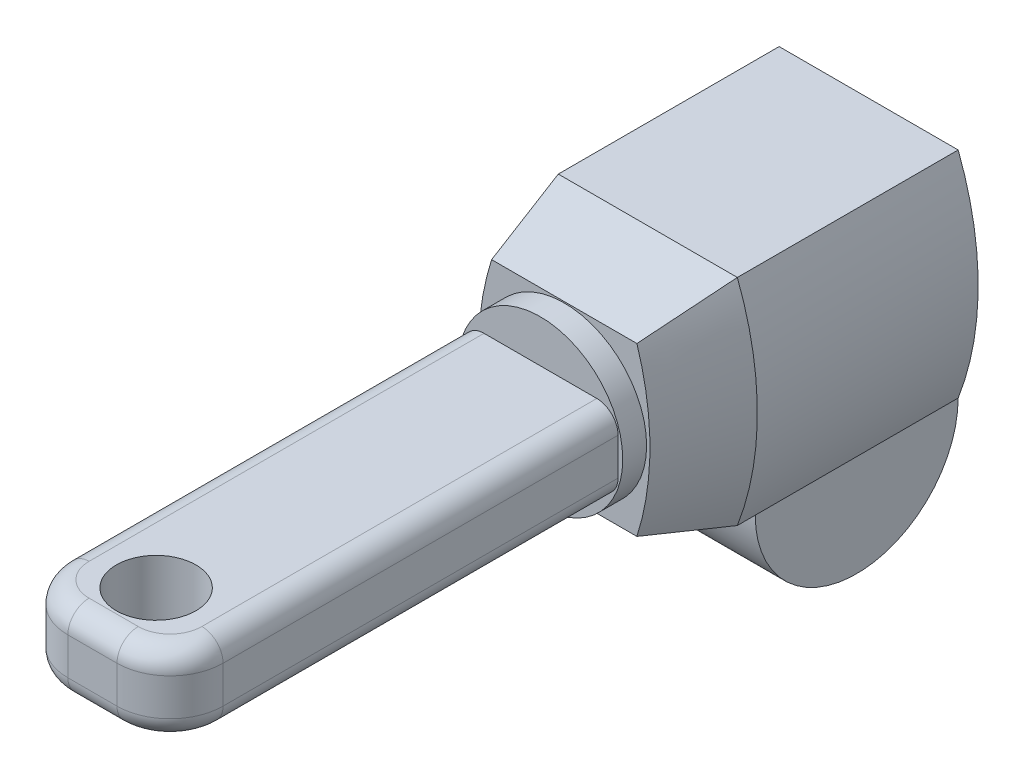
ISO-10303-21;
HEADER;
FILE_DESCRIPTION(('STEP AP214'),'2;1');
FILE_NAME('part.step','',(''),(''),'','','');
FILE_SCHEMA(('AUTOMOTIVE_DESIGN { 1 0 10303 214 1 1 1 1 }'));
ENDSEC;
DATA;
#1=APPLICATION_CONTEXT('core data for automotive mechanical design processes');
#2=APPLICATION_PROTOCOL_DEFINITION('international standard','automotive_design',2000,#1);
#3=PRODUCT_CONTEXT('',#1,'mechanical');
#4=PRODUCT('Part','Part','',(#3));
#5=PRODUCT_RELATED_PRODUCT_CATEGORY('part','',(#4));
#6=PRODUCT_DEFINITION_FORMATION('','',#4);
#7=PRODUCT_DEFINITION_CONTEXT('part definition',#1,'design');
#8=PRODUCT_DEFINITION('design','',#6,#7);
#9=PRODUCT_DEFINITION_SHAPE('','',#8);
#10=(LENGTH_UNIT() NAMED_UNIT(*) SI_UNIT(.MILLI.,.METRE.));
#11=(NAMED_UNIT(*) PLANE_ANGLE_UNIT() SI_UNIT($,.RADIAN.));
#12=(NAMED_UNIT(*) SI_UNIT($,.STERADIAN.) SOLID_ANGLE_UNIT());
#13=UNCERTAINTY_MEASURE_WITH_UNIT(LENGTH_MEASURE(1.E-05),#10,'distance_accuracy_value','');
#14=(GEOMETRIC_REPRESENTATION_CONTEXT(3) GLOBAL_UNCERTAINTY_ASSIGNED_CONTEXT((#13)) GLOBAL_UNIT_ASSIGNED_CONTEXT((#10,
#11,#12)) REPRESENTATION_CONTEXT('',''));
#15=CARTESIAN_POINT('',(0.,0.,0.));
#16=DIRECTION('',(0.,0.,1.));
#17=DIRECTION('',(1.,0.,0.));
#18=AXIS2_PLACEMENT_3D('',#15,#16,#17);
#19=CARTESIAN_POINT('',(-36.1419187009576,-5.641327459746,110.472156997198));
#20=DIRECTION('',(0.,0.,1.));
#21=DIRECTION('',(1.,0.,0.));
#22=AXIS2_PLACEMENT_3D('',#19,#20,#21);
#23=PLANE('',#22);
#24=CARTESIAN_POINT('',(-36.1419187009576,-5.641327459746,110.472156997198));
#25=DIRECTION('',(0.,0.,1.));
#26=DIRECTION('',(1.,0.,0.));
#27=AXIS2_PLACEMENT_3D('',#24,#25,#26);
#28=CIRCLE('',#27,51.75);
#29=CARTESIAN_POINT('',(13.1531114745073,-21.391327459746,110.472156997198));
#30=VERTEX_POINT('',#29);
#31=CARTESIAN_POINT('',(13.1531114745073,10.108672540254,110.472156997198));
#32=VERTEX_POINT('',#31);
#33=EDGE_CURVE('E435',#30,#32,#28,.T.);
#34=ORIENTED_EDGE('',*,*,#33,.T.);
#35=DIRECTION('',(-1.,0.,0.));
#36=VECTOR('',#35,1.);
#37=CARTESIAN_POINT('',(13.1531114745073,10.108672540254,110.472156997198));
#38=LINE('',#37,#36);
#39=CARTESIAN_POINT('',(-14.2298147692071,10.108672540254,110.472156997198));
#40=VERTEX_POINT('',#39);
#41=EDGE_CURVE('E369',#32,#40,#38,.T.);
#42=ORIENTED_EDGE('',*,*,#41,.T.);
#43=CARTESIAN_POINT('',(35.0652154062578,-5.64132745974601,110.472156997198));
#44=DIRECTION('',(0.,0.,1.));
#45=DIRECTION('',(1.,0.,0.));
#46=AXIS2_PLACEMENT_3D('',#43,#44,#45);
#47=CIRCLE('',#46,51.75);
#48=CARTESIAN_POINT('',(-14.2298147692071,-21.391327459746,110.472156997198));
#49=VERTEX_POINT('',#48);
#50=EDGE_CURVE('E383',#40,#49,#47,.T.);
#51=ORIENTED_EDGE('',*,*,#50,.T.);
#52=DIRECTION('',(1.,0.,0.));
#53=VECTOR('',#52,1.);
#54=CARTESIAN_POINT('',(-14.2298147692071,-21.391327459746,110.472156997198));
#55=LINE('',#54,#53);
#56=EDGE_CURVE('E459',#49,#30,#55,.T.);
#57=ORIENTED_EDGE('',*,*,#56,.T.);
#58=EDGE_LOOP('',(#34,#42,#51,#57));
#59=FACE_BOUND('',#58,.T.);
#60=CARTESIAN_POINT('',(-0.538351647349898,-5.64132745974601,110.472156997198));
#61=DIRECTION('',(0.,0.,1.));
#62=DIRECTION('',(1.,0.,0.));
#63=AXIS2_PLACEMENT_3D('',#60,#61,#62);
#64=CIRCLE('',#63,15.525);
#65=CARTESIAN_POINT('',(14.9866483526501,-5.64132745974601,110.472156997198));
#66=VERTEX_POINT('',#65);
#67=EDGE_CURVE('E454',#66,#66,#64,.T.);
#68=ORIENTED_EDGE('',*,*,#67,.F.);
#69=EDGE_LOOP('',(#68));
#70=FACE_BOUND('',#69,.T.);
#71=ADVANCED_FACE('F65',(#59,#70),#23,.T.);
#72=CARTESIAN_POINT('',(-0.538351647349898,-5.64132745974601,114.972156997198));
#73=DIRECTION('',(0.,0.,-1.));
#74=DIRECTION('',(-1.,0.,0.));
#75=AXIS2_PLACEMENT_3D('',#72,#73,#74);
#76=CYLINDRICAL_SURFACE('',#75,15.525);
#77=ORIENTED_EDGE('',*,*,#67,.T.);
#78=EDGE_LOOP('',(#77));
#79=FACE_BOUND('',#78,.T.);
#80=CARTESIAN_POINT('',(-0.538351647349898,-5.64132745974601,114.972156997198));
#81=DIRECTION('',(0.,0.,1.));
#82=DIRECTION('',(1.,0.,0.));
#83=AXIS2_PLACEMENT_3D('',#80,#81,#82);
#84=CIRCLE('',#83,15.525);
#85=CARTESIAN_POINT('',(14.9866483526501,-5.64132745974601,114.972156997198));
#86=VERTEX_POINT('',#85);
#87=EDGE_CURVE('E300',#86,#86,#84,.T.);
#88=ORIENTED_EDGE('',*,*,#87,.F.);
#89=EDGE_LOOP('',(#88));
#90=FACE_BOUND('',#89,.T.);
#91=ADVANCED_FACE('F331',(#79,#90),#76,.T.);
#92=CARTESIAN_POINT('',(-0.538351647349898,-5.64132745974601,114.972156997198));
#93=DIRECTION('',(0.,0.,1.));
#94=DIRECTION('',(1.,0.,0.));
#95=AXIS2_PLACEMENT_3D('',#92,#93,#94);
#96=PLANE('',#95);
#97=ORIENTED_EDGE('',*,*,#87,.T.);
#98=EDGE_LOOP('',(#97));
#99=FACE_BOUND('',#98,.T.);
#100=DIRECTION('',(-1.,0.,0.));
#101=VECTOR('',#100,1.);
#102=CARTESIAN_POINT('',(-0.538351647349898,1.85867254025399,114.972156997198));
#103=LINE('',#102,#101);
#104=CARTESIAN_POINT('',(10.1026961262499,1.85867254025399,114.972156997198));
#105=VERTEX_POINT('',#104);
#106=CARTESIAN_POINT('',(-11.1633516473499,1.85867254025399,114.972156997198));
#107=VERTEX_POINT('',#106);
#108=EDGE_CURVE('E178',#105,#107,#103,.T.);
#109=ORIENTED_EDGE('',*,*,#108,.F.);
#110=CARTESIAN_POINT('',(10.1026961262499,-2.14132745974601,114.972156997198));
#111=DIRECTION('',(0.,0.,1.));
#112=DIRECTION('',(1.,0.,0.));
#113=AXIS2_PLACEMENT_3D('',#110,#111,#112);
#114=CIRCLE('',#113,4.);
#115=CARTESIAN_POINT('',(14.1026961262499,-2.14132745974601,114.972156997198));
#116=VERTEX_POINT('',#115);
#117=EDGE_CURVE('E12',#105,#116,#114,.F.);
#118=ORIENTED_EDGE('',*,*,#117,.T.);
#119=DIRECTION('',(0.,-1.,0.));
#120=VECTOR('',#119,1.);
#121=CARTESIAN_POINT('',(14.1026961262499,-5.64132745974601,114.972156997198));
#122=LINE('',#121,#120);
#123=CARTESIAN_POINT('',(14.1026961262499,-9.14132745974601,114.972156997198));
#124=VERTEX_POINT('',#123);
#125=EDGE_CURVE('E508',#116,#124,#122,.T.);
#126=ORIENTED_EDGE('',*,*,#125,.T.);
#127=CARTESIAN_POINT('',(10.1026961262499,-9.14132745974601,114.972156997198));
#128=DIRECTION('',(0.,0.,1.));
#129=DIRECTION('',(1.,0.,0.));
#130=AXIS2_PLACEMENT_3D('',#127,#128,#129);
#131=CIRCLE('',#130,4.);
#132=CARTESIAN_POINT('',(10.1026961262499,-13.141327459746,114.972156997198));
#133=VERTEX_POINT('',#132);
#134=EDGE_CURVE('E108',#124,#133,#131,.F.);
#135=ORIENTED_EDGE('',*,*,#134,.T.);
#136=DIRECTION('',(-1.,0.,0.));
#137=VECTOR('',#136,1.);
#138=CARTESIAN_POINT('',(-0.538351647349898,-13.141327459746,114.972156997198));
#139=LINE('',#138,#137);
#140=CARTESIAN_POINT('',(-11.1633516473499,-13.141327459746,114.972156997198));
#141=VERTEX_POINT('',#140);
#142=EDGE_CURVE('E506',#133,#141,#139,.T.);
#143=ORIENTED_EDGE('',*,*,#142,.T.);
#144=CARTESIAN_POINT('',(-11.1633516473499,-9.14132745974601,114.972156997198));
#145=DIRECTION('',(0.,0.,1.));
#146=DIRECTION('',(1.,0.,0.));
#147=AXIS2_PLACEMENT_3D('',#144,#145,#146);
#148=CIRCLE('',#147,4.);
#149=CARTESIAN_POINT('',(-15.1633516473499,-9.14132745974601,114.972156997198));
#150=VERTEX_POINT('',#149);
#151=EDGE_CURVE('E75',#141,#150,#148,.F.);
#152=ORIENTED_EDGE('',*,*,#151,.T.);
#153=DIRECTION('',(0.,1.,0.));
#154=VECTOR('',#153,1.);
#155=CARTESIAN_POINT('',(-15.1633516473499,-5.64132745974601,114.972156997198));
#156=LINE('',#155,#154);
#157=CARTESIAN_POINT('',(-15.1633516473499,-2.14132745974601,114.972156997198));
#158=VERTEX_POINT('',#157);
#159=EDGE_CURVE('E200',#150,#158,#156,.T.);
#160=ORIENTED_EDGE('',*,*,#159,.T.);
#161=CARTESIAN_POINT('',(-11.1633516473499,-2.14132745974601,114.972156997198));
#162=DIRECTION('',(0.,0.,1.));
#163=DIRECTION('',(1.,0.,0.));
#164=AXIS2_PLACEMENT_3D('',#161,#162,#163);
#165=CIRCLE('',#164,4.);
#166=EDGE_CURVE('E186',#158,#107,#165,.F.);
#167=ORIENTED_EDGE('',*,*,#166,.T.);
#168=EDGE_LOOP('',(#109,#118,#126,#135,#143,#152,#160,#167));
#169=FACE_BOUND('',#168,.T.);
#170=ADVANCED_FACE('F328',(#99,#169),#96,.T.);
#171=CARTESIAN_POINT('',(35.0652154062578,-5.64132745974601,94.7221569971984));
#172=DIRECTION('',(0.,0.,-1.));
#173=DIRECTION('',(-1.,0.,0.));
#174=AXIS2_PLACEMENT_3D('',#171,#172,#173);
#175=CYLINDRICAL_SURFACE('',#174,56.25);
#176=CARTESIAN_POINT('',(35.0652154062578,-5.64132745974601,53.0971569971984));
#177=DIRECTION('',(0.,0.,-1.));
#178=DIRECTION('',(-1.,0.,0.));
#179=AXIS2_PLACEMENT_3D('',#176,#177,#178);
#180=CIRCLE('',#179,56.25);
#181=CARTESIAN_POINT('',(-17.4133516473499,-25.891327459746,53.0971569971984));
#182=VERTEX_POINT('',#181);
#183=CARTESIAN_POINT('',(-17.4133516473499,14.608672540254,53.0971569971984));
#184=VERTEX_POINT('',#183);
#185=EDGE_CURVE('E277',#182,#184,#180,.T.);
#186=ORIENTED_EDGE('',*,*,#185,.F.);
#187=CARTESIAN_POINT('',(-17.4133516473499,-25.891327459746,91.3471569971984));
#188=CARTESIAN_POINT('',(-17.5104185757161,-25.6397807753165,91.3471566376483));
#189=CARTESIAN_POINT('',(-17.6056633746791,-25.3875583189539,91.3421932669848));
#190=CARTESIAN_POINT('',(-17.7923983084979,-24.8821107409464,91.3221857952732));
#191=CARTESIAN_POINT('',(-17.8838882390162,-24.6288855655544,91.3071411463784));
#192=CARTESIAN_POINT('',(-18.1525643347171,-23.8682145123364,91.2466495400304));
#193=CARTESIAN_POINT('',(-18.323935320634,-23.3598288088188,91.1858448545382));
#194=CARTESIAN_POINT('',(-18.6503120880124,-22.3443005606894,91.0223940848979));
#195=CARTESIAN_POINT('',(-18.8053101320169,-21.8371587134932,90.9197283286111));
#196=CARTESIAN_POINT('',(-19.0983551143492,-20.8283591851154,90.6721335333653));
#197=CARTESIAN_POINT('',(-19.2364043024954,-20.3267007841233,90.527210112395));
#198=CARTESIAN_POINT('',(-19.4957512707842,-19.3317763649012,90.1947390738719));
#199=CARTESIAN_POINT('',(-19.6170061642389,-18.8385345538694,90.0070854524369));
#200=CARTESIAN_POINT('',(-19.8426022423871,-17.8660263514256,89.5899465150905));
#201=CARTESIAN_POINT('',(-19.9469425521553,-17.3867606839958,89.360459036581));
#202=CARTESIAN_POINT('',(-20.1392314256772,-16.4469480601791,88.8610341093282));
#203=CARTESIAN_POINT('',(-20.2271951536682,-15.9863840987284,88.5911345031749));
#204=CARTESIAN_POINT('',(-20.3878137323153,-15.0876221134801,88.012382975135));
#205=CARTESIAN_POINT('',(-20.460469156566,-14.6494232521394,87.7035325134113));
#206=CARTESIAN_POINT('',(-20.5894799721445,-13.8138407738726,87.0602281339933));
#207=CARTESIAN_POINT('',(-20.6463092745931,-13.4155724473205,86.7270170084952));
#208=CARTESIAN_POINT('',(-20.7482067567926,-12.6466708110797,86.0284771800277));
#209=CARTESIAN_POINT('',(-20.7932751672224,-12.2760369594687,85.6631491071899));
#210=CARTESIAN_POINT('',(-20.8731346536954,-11.5651379562057,84.9027305994956));
#211=CARTESIAN_POINT('',(-20.907921385823,-11.2248856827424,84.5076276732519));
#212=CARTESIAN_POINT('',(-20.968725538915,-10.5774905622935,83.6905363375567));
#213=CARTESIAN_POINT('',(-20.9947428432628,-10.2703481556427,83.2685475706639));
#214=CARTESIAN_POINT('',(-21.0396925676538,-9.68944854732893,82.3976468224195));
#215=CARTESIAN_POINT('',(-21.0585753686107,-9.41593377350929,81.9485705963275));
#216=CARTESIAN_POINT('',(-21.0905033494419,-8.90673105934653,81.0292687886211));
#217=CARTESIAN_POINT('',(-21.1035485217847,-8.67104316780679,80.5590431797213));
#218=CARTESIAN_POINT('',(-21.125179230751,-8.23917663797602,79.6007335581555));
#219=CARTESIAN_POINT('',(-21.1337651121824,-8.04299494564709,79.1126509293812));
#220=CARTESIAN_POINT('',(-21.1476864014735,-7.69148116201624,78.1219447018919));
#221=CARTESIAN_POINT('',(-21.1530217732321,-7.53614952441832,77.6193209417437));
#222=CARTESIAN_POINT('',(-21.161510326557,-7.26507359542771,76.5941427071447));
#223=CARTESIAN_POINT('',(-21.164624028168,-7.15006314768279,76.071393722322));
#224=CARTESIAN_POINT('',(-21.1693027692721,-6.96424630354087,75.0180876652528));
#225=CARTESIAN_POINT('',(-21.1708677910705,-6.89344041221005,74.4875305038635));
#226=CARTESIAN_POINT('',(-21.1729421553996,-6.79652954503723,73.4223068807877));
#227=CARTESIAN_POINT('',(-21.1734514196453,-6.77042788405541,72.8876401173227));
#228=CARTESIAN_POINT('',(-21.1735976560809,-6.76311974625605,71.8180004558146));
#229=CARTESIAN_POINT('',(-21.1732346279763,-6.78191328459034,71.2830275576682));
#230=CARTESIAN_POINT('',(-21.1714998466945,-6.86446616203042,70.2139147360239));
#231=CARTESIAN_POINT('',(-21.1701231419361,-6.92844616395525,69.6797918450116));
#232=CARTESIAN_POINT('',(-21.1659045236098,-7.10115568053041,68.618833944166));
#233=CARTESIAN_POINT('',(-21.163062602605,-7.20988542231002,68.0919989713368));
#234=CARTESIAN_POINT('',(-21.1551608933048,-7.47131980924598,67.0493622093791));
#235=CARTESIAN_POINT('',(-21.1501010702615,-7.62402514335496,66.5335605932429));
#236=CARTESIAN_POINT('',(-21.1367360995137,-7.97231258826303,65.5166843203967));
#237=CARTESIAN_POINT('',(-21.1284309575771,-8.1678946228574,65.0156096375144));
#238=CARTESIAN_POINT('',(-21.107316610472,-8.60037386382517,64.0321059383534));
#239=CARTESIAN_POINT('',(-21.0945103589628,-8.83724392545267,63.5496649243968));
#240=CARTESIAN_POINT('',(-21.0629378660241,-9.35064243581475,62.6065648204316));
#241=CARTESIAN_POINT('',(-21.0441716170068,-9.62717093503986,62.1459057581554));
#242=CARTESIAN_POINT('',(-20.9990878944046,-10.2177967043679,61.2497353279577));
#243=CARTESIAN_POINT('',(-20.9727705955186,-10.5318931052125,60.8142233785197));
#244=CARTESIAN_POINT('',(-20.9109189497531,-11.1952263998526,59.9715342154452));
#245=CARTESIAN_POINT('',(-20.8753847128224,-11.5444628744324,59.5643566638816));
#246=CARTESIAN_POINT('',(-20.7938382290203,-12.2716446707778,58.7852307286668));
#247=CARTESIAN_POINT('',(-20.7479338804899,-12.6492693683617,58.4129718253275));
#248=CARTESIAN_POINT('',(-20.6439030655714,-13.4331758871302,57.701821819679));
#249=CARTESIAN_POINT('',(-20.5857766435096,-13.8394576043792,57.3629305963599));
#250=CARTESIAN_POINT('',(-20.4559078460925,-14.6771979905842,56.7209523166741));
#251=CARTESIAN_POINT('',(-20.3841685720213,-15.1086509095545,56.4178571307103));
#252=CARTESIAN_POINT('',(-20.2258729946382,-15.9931305610181,55.8493846943496));
#253=CARTESIAN_POINT('',(-20.1393171700024,-16.4461565962103,55.5840062259506));
#254=CARTESIAN_POINT('',(-19.9522198474631,-17.3613265037998,55.0970764161716));
#255=CARTESIAN_POINT('',(-19.8519668639369,-17.8231464136026,54.8748047907129));
#256=CARTESIAN_POINT('',(-19.6357344034792,-18.7600049299962,54.4691161710078));
#257=CARTESIAN_POINT('',(-19.5197540565106,-19.2350442667289,54.2857013277564));
#258=CARTESIAN_POINT('',(-19.2718449401945,-20.1943941679933,53.9583289317497));
#259=CARTESIAN_POINT('',(-19.139918001733,-20.6787036628209,53.8143668554686));
#260=CARTESIAN_POINT('',(-18.86025347897,-21.6526685839844,53.566005688811));
#261=CARTESIAN_POINT('',(-18.7125201108855,-22.1423225535934,53.4615960817568));
#262=CARTESIAN_POINT('',(-18.3845023709013,-23.1774649096015,53.2826276949992));
#263=CARTESIAN_POINT('',(-18.2024249792892,-23.7231811482907,53.2126047703829));
#264=CARTESIAN_POINT('',(-17.9160885211457,-24.5391306520538,53.1430697439539));
#265=CARTESIAN_POINT('',(-17.8185624114881,-24.8103580259568,53.12580748524));
#266=CARTESIAN_POINT('',(-17.6191725658775,-25.3517564032426,53.1028507054192));
#267=CARTESIAN_POINT('',(-17.5173081394036,-25.6219272309288,53.0971580328977));
#268=CARTESIAN_POINT('',(-17.4133516473499,-25.891327459746,53.0971569971984));
#269=B_SPLINE_CURVE_WITH_KNOTS('',3,(#187,#188,#189,#190,#191,#192,#193,#194,#195,#196,#197,
#198,#199,#200,#201,#202,#203,#204,#205,#206,#207,#208,#209,#210,#211,#212,#213,#214,#215,#216,
#217,#218,#219,#220,#221,#222,#223,#224,#225,#226,#227,#228,#229,#230,#231,#232,#233,#234,#235,
#236,#237,#238,#239,#240,#241,#242,#243,#244,#245,#246,#247,#248,#249,#250,#251,#252,#253,#254,
#255,#256,#257,#258,#259,#260,#261,#262,#263,#264,#265,#266,#267,#268),.UNSPECIFIED.,.F.,.F.,(4,
2,2,2,2,2,2,2,2,2,2,2,2,2,2,2,2,2,2,2,2,2,2,2,2,2,2,2,2,2,2,2,2,2,2,2,2,2,2,2,4),(0.,
0.808768404537017,1.61758076352306,3.23538405668106,4.85394849612409,6.47229785188958,
8.09470656763977,9.71719917748636,11.3381818517428,12.9591037777625,14.524385334762,
16.0896361879327,17.6555474031703,19.2214794412018,20.7981100883764,22.3747427696683,
23.951253522097,25.527781783414,27.1316713931021,28.7355793279501,30.3396061889123,
31.9436335912233,33.5555487250506,35.1674720403251,36.7794206105012,38.3913663157859,
40.0022562199447,41.6131481750011,43.2240028639247,44.8348383378767,46.4296281179534,
48.0244121142139,49.6188332215574,51.213202827871,52.7780621553322,54.3430080860956,
55.9077745101192,57.4721245830505,59.2082245208451,60.0742343114978,60.9403824620825),.UNSPECIFIED.);
#270=CARTESIAN_POINT('',(-17.4133516473499,-25.891327459746,91.3471569971984));
#271=VERTEX_POINT('',#270);
#272=EDGE_CURVE('E292',#271,#182,#269,.T.);
#273=ORIENTED_EDGE('',*,*,#272,.F.);
#274=DIRECTION('',(0.,0.,-1.));
#275=VECTOR('',#274,1.);
#276=CARTESIAN_POINT('',(-17.4133516473499,-25.891327459746,94.7221569971984));
#277=LINE('',#276,#275);
#278=CARTESIAN_POINT('',(-17.4133516473499,-25.891327459746,94.7221569971984));
#279=VERTEX_POINT('',#278);
#280=EDGE_CURVE('E447',#279,#271,#277,.T.);
#281=ORIENTED_EDGE('',*,*,#280,.F.);
#282=CARTESIAN_POINT('',(35.0652154062578,-5.64132745974601,94.7221569971984));
#283=DIRECTION('',(0.,0.,-1.));
#284=DIRECTION('',(-1.,0.,0.));
#285=AXIS2_PLACEMENT_3D('',#282,#283,#284);
#286=CIRCLE('',#285,56.25);
#287=CARTESIAN_POINT('',(-17.4133516473499,14.608672540254,94.7221569971984));
#288=VERTEX_POINT('',#287);
#289=EDGE_CURVE('E462',#288,#279,#286,.F.);
#290=ORIENTED_EDGE('',*,*,#289,.F.);
#291=DIRECTION('',(0.,0.,-1.));
#292=VECTOR('',#291,1.);
#293=CARTESIAN_POINT('',(-17.4133516473499,14.608672540254,94.7221569971984));
#294=LINE('',#293,#292);
#295=EDGE_CURVE('E295',#288,#184,#294,.T.);
#296=ORIENTED_EDGE('',*,*,#295,.T.);
#297=EDGE_LOOP('',(#186,#273,#281,#290,#296));
#298=FACE_BOUND('',#297,.T.);
#299=ADVANCED_FACE('F291',(#298),#175,.T.);
#300=CARTESIAN_POINT('',(-36.1419187009576,-5.641327459746,94.7221569971984));
#301=DIRECTION('',(0.,0.,-1.));
#302=DIRECTION('',(-1.,0.,0.));
#303=AXIS2_PLACEMENT_3D('',#300,#301,#302);
#304=CYLINDRICAL_SURFACE('',#303,56.25);
#305=CARTESIAN_POINT('',(-36.1419187009576,-5.641327459746,53.0971569971984));
#306=DIRECTION('',(0.,0.,-1.));
#307=DIRECTION('',(-1.,0.,0.));
#308=AXIS2_PLACEMENT_3D('',#305,#306,#307);
#309=CIRCLE('',#308,56.25);
#310=CARTESIAN_POINT('',(16.3366483526501,14.608672540254,53.0971569971984));
#311=VERTEX_POINT('',#310);
#312=CARTESIAN_POINT('',(16.3366483526501,-25.891327459746,53.0971569971984));
#313=VERTEX_POINT('',#312);
#314=EDGE_CURVE('E280',#311,#313,#309,.T.);
#315=ORIENTED_EDGE('',*,*,#314,.F.);
#316=DIRECTION('',(0.,0.,-1.));
#317=VECTOR('',#316,1.);
#318=CARTESIAN_POINT('',(16.3366483526501,14.608672540254,94.7221569971984));
#319=LINE('',#318,#317);
#320=CARTESIAN_POINT('',(16.3366483526501,14.608672540254,94.7221569971985));
#321=VERTEX_POINT('',#320);
#322=EDGE_CURVE('E451',#321,#311,#319,.T.);
#323=ORIENTED_EDGE('',*,*,#322,.F.);
#324=CARTESIAN_POINT('',(-36.1419187009576,-5.641327459746,94.7221569971984));
#325=DIRECTION('',(0.,0.,-1.));
#326=DIRECTION('',(-1.,0.,0.));
#327=AXIS2_PLACEMENT_3D('',#324,#325,#326);
#328=CIRCLE('',#327,56.25);
#329=CARTESIAN_POINT('',(16.3366483526501,-25.891327459746,94.7221569971984));
#330=VERTEX_POINT('',#329);
#331=EDGE_CURVE('E455',#330,#321,#328,.F.);
#332=ORIENTED_EDGE('',*,*,#331,.F.);
#333=DIRECTION('',(0.,0.,-1.));
#334=VECTOR('',#333,1.);
#335=CARTESIAN_POINT('',(16.3366483526501,-25.891327459746,94.7221569971984));
#336=LINE('',#335,#334);
#337=CARTESIAN_POINT('',(16.3366483526501,-25.891327459746,91.3471569971985));
#338=VERTEX_POINT('',#337);
#339=EDGE_CURVE('E439',#330,#338,#336,.T.);
#340=ORIENTED_EDGE('',*,*,#339,.T.);
#341=DIRECTION('',(0.,0.,1.));
#342=VECTOR('',#341,1.);
#343=CARTESIAN_POINT('',(16.3366483526501,-25.891327459746,81.2221569971984));
#344=LINE('',#343,#342);
#345=EDGE_CURVE('E520',#313,#338,#344,.T.);
#346=ORIENTED_EDGE('',*,*,#345,.F.);
#347=EDGE_LOOP('',(#315,#323,#332,#340,#346));
#348=FACE_BOUND('',#347,.T.);
#349=ADVANCED_FACE('F857',(#348),#304,.T.);
#350=CARTESIAN_POINT('',(-17.4133516473499,14.608672540254,94.7221569971984));
#351=DIRECTION('',(0.,-1.,0.));
#352=DIRECTION('',(1.,0.,0.));
#353=AXIS2_PLACEMENT_3D('',#350,#351,#352);
#354=PLANE('',#353);
#355=DIRECTION('',(1.,0.,0.));
#356=VECTOR('',#355,1.);
#357=CARTESIAN_POINT('',(-17.4133516473499,14.608672540254,53.0971569971984));
#358=LINE('',#357,#356);
#359=EDGE_CURVE('E296',#184,#311,#358,.T.);
#360=ORIENTED_EDGE('',*,*,#359,.F.);
#361=ORIENTED_EDGE('',*,*,#295,.F.);
#362=DIRECTION('',(1.,0.,0.));
#363=VECTOR('',#362,1.);
#364=CARTESIAN_POINT('',(-0.538351647349905,14.608672540254,94.7221569971985));
#365=LINE('',#364,#363);
#366=EDGE_CURVE('E458',#321,#288,#365,.F.);
#367=ORIENTED_EDGE('',*,*,#366,.F.);
#368=ORIENTED_EDGE('',*,*,#322,.T.);
#369=EDGE_LOOP('',(#360,#361,#367,#368));
#370=FACE_BOUND('',#369,.T.);
#371=ADVANCED_FACE('F849',(#370),#354,.F.);
#372=CARTESIAN_POINT('',(-17.4133516473499,-25.891327459746,94.7221569971984));
#373=DIRECTION('',(0.,1.,0.));
#374=DIRECTION('',(-1.,0.,0.));
#375=AXIS2_PLACEMENT_3D('',#372,#373,#374);
#376=PLANE('',#375);
#377=DIRECTION('',(-1.,0.,0.));
#378=VECTOR('',#377,1.);
#379=CARTESIAN_POINT('',(-12.6883516473499,-25.891327459746,91.3471569971984));
#380=LINE('',#379,#378);
#381=EDGE_CURVE('E286',#338,#271,#380,.T.);
#382=ORIENTED_EDGE('',*,*,#381,.F.);
#383=ORIENTED_EDGE('',*,*,#339,.F.);
#384=DIRECTION('',(1.,0.,0.));
#385=VECTOR('',#384,1.);
#386=CARTESIAN_POINT('',(-0.538351647349891,-25.891327459746,94.7221569971984));
#387=LINE('',#386,#385);
#388=EDGE_CURVE('E448',#279,#330,#387,.T.);
#389=ORIENTED_EDGE('',*,*,#388,.F.);
#390=ORIENTED_EDGE('',*,*,#280,.T.);
#391=EDGE_LOOP('',(#382,#383,#389,#390));
#392=FACE_BOUND('',#391,.T.);
#393=ADVANCED_FACE('F343',(#392),#376,.F.);
#394=CARTESIAN_POINT('',(16.3366483526501,-25.891327459746,94.7221569971984));
#395=CARTESIAN_POINT('',(13.1531114745073,-21.391327459746,110.472156997198));
#396=CARTESIAN_POINT('',(21.4240472729395,-12.7071592934813,94.7221569971984));
#397=CARTESIAN_POINT('',(16.4531301045513,-11.0627866376754,110.472156997198));
#398=CARTESIAN_POINT('',(21.4240472729395,1.42450437398931,94.7221569971984));
#399=CARTESIAN_POINT('',(16.4531301045513,-0.219868281816686,110.472156997198));
#400=CARTESIAN_POINT('',(16.3366483526501,14.608672540254,94.7221569971984));
#401=CARTESIAN_POINT('',(13.1531114745073,10.108672540254,110.472156997198));
#402=(BOUNDED_SURFACE() B_SPLINE_SURFACE(3,1,((#394,#395),(#396,#397),(#398,#399),(#400,#401)),
.UNSPECIFIED.,.F.,.F.,.F.) B_SPLINE_SURFACE_WITH_KNOTS((4,4),(2,2),(0.,1.),(0.,1.),
.UNSPECIFIED.) GEOMETRIC_REPRESENTATION_ITEM() RATIONAL_B_SPLINE_SURFACE(((1.,1.),
(0.955301535450165,0.968373979716135),(0.955301535450165,0.968373979716135),(1.,1.))) REPRESENTATION_ITEM('') SURFACE());
#403=DIRECTION('',(-0.190782394849939,-0.269675147386885,0.943863015854093));
#404=VECTOR('',#403,1.);
#405=CARTESIAN_POINT('',(14.7448799135787,12.358672540254,102.597156997198));
#406=LINE('',#405,#404);
#407=EDGE_CURVE('E478',#321,#32,#406,.T.);
#408=DIRECTION('',(0.19078239484994,-0.269675147386883,-0.943863015854094));
#409=VECTOR('',#408,1.);
#410=CARTESIAN_POINT('',(14.7448799135787,-23.641327459746,102.597156997198));
#411=LINE('',#410,#409);
#412=EDGE_CURVE('E304',#30,#330,#411,.T.);
#413=ORIENTED_EDGE('',*,*,#331,.T.);
#414=ORIENTED_EDGE('',*,*,#407,.T.);
#415=ORIENTED_EDGE('',*,*,#33,.F.);
#416=ORIENTED_EDGE('',*,*,#412,.T.);
#417=EDGE_LOOP('',(#413,#414,#415,#416));
#418=FACE_BOUND('',#417,.T.);
#419=ADVANCED_FACE('F336',(#418),#402,.T.);
#420=CARTESIAN_POINT('',(-0.538351647349905,24.9671631062917,58.4674400160664));
#421=DIRECTION('',(0.,-0.961523947640823,-0.274721127897378));
#422=DIRECTION('',(0.,0.274721127897378,-0.961523947640823));
#423=AXIS2_PLACEMENT_3D('',#420,#421,#422);
#424=PLANE('',#423);
#425=DIRECTION('',(0.190782394849939,-0.269675147386884,0.943863015854093));
#426=VECTOR('',#425,1.);
#427=CARTESIAN_POINT('',(-17.4133516473499,14.608672540254,94.7221569971984));
#428=LINE('',#427,#426);
#429=EDGE_CURVE('E483',#288,#40,#428,.T.);
#430=ORIENTED_EDGE('',*,*,#429,.T.);
#431=ORIENTED_EDGE('',*,*,#41,.F.);
#432=ORIENTED_EDGE('',*,*,#407,.F.);
#433=ORIENTED_EDGE('',*,*,#366,.T.);
#434=EDGE_LOOP('',(#430,#431,#432,#433));
#435=FACE_BOUND('',#434,.T.);
#436=ADVANCED_FACE('F342',(#435),#424,.F.);
#437=CARTESIAN_POINT('',(-0.538351647349891,-36.2498180257837,58.4674400160663));
#438=DIRECTION('',(0.,0.961523947640823,-0.274721127897377));
#439=DIRECTION('',(0.,0.274721127897377,0.961523947640823));
#440=AXIS2_PLACEMENT_3D('',#437,#438,#439);
#441=PLANE('',#440);
#442=ORIENTED_EDGE('',*,*,#412,.F.);
#443=ORIENTED_EDGE('',*,*,#56,.F.);
#444=DIRECTION('',(0.190782394849939,0.269675147386885,0.943863015854093));
#445=VECTOR('',#444,1.);
#446=CARTESIAN_POINT('',(-15.8215832082785,-23.641327459746,102.597156997198));
#447=LINE('',#446,#445);
#448=EDGE_CURVE('E479',#279,#49,#447,.T.);
#449=ORIENTED_EDGE('',*,*,#448,.F.);
#450=ORIENTED_EDGE('',*,*,#388,.T.);
#451=EDGE_LOOP('',(#442,#443,#449,#450));
#452=FACE_BOUND('',#451,.T.);
#453=ADVANCED_FACE('F400',(#452),#441,.F.);
#454=CARTESIAN_POINT('',(-17.4133516473499,14.608672540254,94.7221569971984));
#455=CARTESIAN_POINT('',(-14.2298147692071,10.108672540254,110.472156997198));
#456=CARTESIAN_POINT('',(-22.5007505676393,1.42450437398928,94.7221569971984));
#457=CARTESIAN_POINT('',(-17.5298333992511,-0.219868281816683,110.472156997198));
#458=CARTESIAN_POINT('',(-22.5007505676393,-12.7071592934813,94.7221569971984));
#459=CARTESIAN_POINT('',(-17.5298333992511,-11.0627866376753,110.472156997198));
#460=CARTESIAN_POINT('',(-17.4133516473499,-25.891327459746,94.7221569971984));
#461=CARTESIAN_POINT('',(-14.2298147692071,-21.391327459746,110.472156997198));
#462=(BOUNDED_SURFACE() B_SPLINE_SURFACE(3,1,((#454,#455),(#456,#457),(#458,#459),(#460,#461)),
.UNSPECIFIED.,.F.,.F.,.F.) B_SPLINE_SURFACE_WITH_KNOTS((4,4),(2,2),(0.,1.),(0.,1.),
.UNSPECIFIED.) GEOMETRIC_REPRESENTATION_ITEM() RATIONAL_B_SPLINE_SURFACE(((1.,1.),
(0.955301535450165,0.968373979716135),(0.955301535450165,0.968373979716135),(1.,1.))) REPRESENTATION_ITEM('') SURFACE());
#463=ORIENTED_EDGE('',*,*,#289,.T.);
#464=ORIENTED_EDGE('',*,*,#448,.T.);
#465=ORIENTED_EDGE('',*,*,#50,.F.);
#466=ORIENTED_EDGE('',*,*,#429,.F.);
#467=EDGE_LOOP('',(#463,#464,#465,#466));
#468=FACE_BOUND('',#467,.T.);
#469=ADVANCED_FACE('F325',(#468),#462,.T.);
#470=CARTESIAN_POINT('',(-12.6883516473499,-25.891327459746,72.2221569971984));
#471=DIRECTION('',(-1.,0.,0.));
#472=DIRECTION('',(0.,0.,1.));
#473=AXIS2_PLACEMENT_3D('',#470,#471,#472);
#474=CYLINDRICAL_SURFACE('',#473,19.125);
#475=CARTESIAN_POINT('',(-22.1383516473499,-25.891327459746,72.2221569971984));
#476=DIRECTION('',(1.,0.,0.));
#477=DIRECTION('',(0.,0.,-1.));
#478=AXIS2_PLACEMENT_3D('',#475,#476,#477);
#479=CIRCLE('',#478,19.125);
#480=CARTESIAN_POINT('',(-22.1383516473499,-25.891327459746,53.0971569971984));
#481=VERTEX_POINT('',#480);
#482=EDGE_CURVE('E301',#481,#481,#479,.T.);
#483=ORIENTED_EDGE('',*,*,#482,.T.);
#484=EDGE_LOOP('',(#483));
#485=FACE_BOUND('',#484,.T.);
#486=ORIENTED_EDGE('',*,*,#272,.T.);
#487=DIRECTION('',(-1.,0.,0.));
#488=VECTOR('',#487,1.);
#489=CARTESIAN_POINT('',(-12.6883516473499,-25.891327459746,53.0971569971984));
#490=LINE('',#489,#488);
#491=EDGE_CURVE('E274',#182,#313,#490,.F.);
#492=ORIENTED_EDGE('',*,*,#491,.T.);
#493=CARTESIAN_POINT('',(16.3366483526501,-25.891327459746,72.2221569971984));
#494=DIRECTION('',(1.,0.,0.));
#495=DIRECTION('',(0.,0.,-1.));
#496=AXIS2_PLACEMENT_3D('',#493,#494,#495);
#497=CIRCLE('',#496,19.125);
#498=EDGE_CURVE('E523',#338,#313,#497,.T.);
#499=ORIENTED_EDGE('',*,*,#498,.F.);
#500=ORIENTED_EDGE('',*,*,#381,.T.);
#501=EDGE_LOOP('',(#486,#492,#499,#500));
#502=FACE_BOUND('',#501,.T.);
#503=ADVANCED_FACE('F299',(#485,#502),#474,.T.);
#504=CARTESIAN_POINT('',(-22.1383516473499,-25.891327459746,72.2221569971984));
#505=DIRECTION('',(1.,0.,0.));
#506=DIRECTION('',(0.,0.,-1.));
#507=AXIS2_PLACEMENT_3D('',#504,#505,#506);
#508=PLANE('',#507);
#509=CARTESIAN_POINT('',(-22.1383516473499,-25.891327459746,72.2221569971984));
#510=DIRECTION('',(-1.,0.,0.));
#511=DIRECTION('',(0.,0.,1.));
#512=AXIS2_PLACEMENT_3D('',#509,#510,#511);
#513=CIRCLE('',#512,6.75);
#514=CARTESIAN_POINT('',(-22.1383516473499,-25.891327459746,78.9721569971984));
#515=VERTEX_POINT('',#514);
#516=EDGE_CURVE('E526',#515,#515,#513,.T.);
#517=ORIENTED_EDGE('',*,*,#516,.F.);
#518=EDGE_LOOP('',(#517));
#519=FACE_BOUND('',#518,.T.);
#520=ORIENTED_EDGE('',*,*,#482,.F.);
#521=EDGE_LOOP('',(#520));
#522=FACE_BOUND('',#521,.T.);
#523=ADVANCED_FACE('F324',(#519,#522),#508,.F.);
#524=CARTESIAN_POINT('',(-13.1383516473499,-25.891327459746,72.2221569971984));
#525=DIRECTION('',(-1.,0.,0.));
#526=DIRECTION('',(0.,0.,1.));
#527=AXIS2_PLACEMENT_3D('',#524,#525,#526);
#528=CYLINDRICAL_SURFACE('',#527,6.75);
#529=CARTESIAN_POINT('',(-13.1383516473499,-25.891327459746,72.2221569971984));
#530=DIRECTION('',(-1.,0.,0.));
#531=DIRECTION('',(0.,0.,1.));
#532=AXIS2_PLACEMENT_3D('',#529,#530,#531);
#533=CIRCLE('',#532,6.75);
#534=CARTESIAN_POINT('',(-13.1383516473499,-25.891327459746,78.9721569971984));
#535=VERTEX_POINT('',#534);
#536=EDGE_CURVE('E307',#535,#535,#533,.T.);
#537=ORIENTED_EDGE('',*,*,#536,.F.);
#538=EDGE_LOOP('',(#537));
#539=FACE_BOUND('',#538,.T.);
#540=ORIENTED_EDGE('',*,*,#516,.T.);
#541=EDGE_LOOP('',(#540));
#542=FACE_BOUND('',#541,.T.);
#543=ADVANCED_FACE('F531',(#539,#542),#528,.F.);
#544=CARTESIAN_POINT('',(-13.1383516473499,-25.891327459746,72.2221569971984));
#545=DIRECTION('',(-1.,0.,0.));
#546=DIRECTION('',(0.,0.,1.));
#547=AXIS2_PLACEMENT_3D('',#544,#545,#546);
#548=PLANE('',#547);
#549=ORIENTED_EDGE('',*,*,#536,.T.);
#550=EDGE_LOOP('',(#549));
#551=FACE_BOUND('',#550,.T.);
#552=ADVANCED_FACE('F539',(#551),#548,.T.);
#553=CARTESIAN_POINT('',(16.3366483526501,-25.891327459746,72.2221569971984));
#554=DIRECTION('',(1.,0.,0.));
#555=DIRECTION('',(0.,0.,-1.));
#556=AXIS2_PLACEMENT_3D('',#553,#554,#555);
#557=PLANE('',#556);
#558=ORIENTED_EDGE('',*,*,#345,.T.);
#559=ORIENTED_EDGE('',*,*,#498,.T.);
#560=EDGE_LOOP('',(#558,#559));
#561=FACE_BOUND('',#560,.T.);
#562=ADVANCED_FACE('F544',(#561),#557,.T.);
#563=CARTESIAN_POINT('',(-36.1419187009576,-5.641327459746,53.0971569971984));
#564=DIRECTION('',(0.,0.,-1.));
#565=DIRECTION('',(-1.,0.,0.));
#566=AXIS2_PLACEMENT_3D('',#563,#564,#565);
#567=PLANE('',#566);
#568=ORIENTED_EDGE('',*,*,#491,.F.);
#569=ORIENTED_EDGE('',*,*,#185,.T.);
#570=ORIENTED_EDGE('',*,*,#359,.T.);
#571=ORIENTED_EDGE('',*,*,#314,.T.);
#572=EDGE_LOOP('',(#568,#569,#570,#571));
#573=FACE_BOUND('',#572,.T.);
#574=ADVANCED_FACE('F276',(#573),#567,.T.);
#575=CARTESIAN_POINT('',(0.,1.85867254025399,0.));
#576=DIRECTION('',(0.,1.,0.));
#577=DIRECTION('',(0.,0.,1.));
#578=AXIS2_PLACEMENT_3D('',#575,#576,#577);
#579=PLANE('',#578);
#580=ORIENTED_EDGE('',*,*,#108,.T.);
#581=DIRECTION('',(0.,0.,1.));
#582=VECTOR('',#581,1.);
#583=CARTESIAN_POINT('',(-11.1633516473499,1.85867254025399,0.));
#584=LINE('',#583,#582);
#585=CARTESIAN_POINT('',(-11.1633516473499,1.85867254025399,189.422156997198));
#586=VERTEX_POINT('',#585);
#587=EDGE_CURVE('E160',#107,#586,#584,.T.);
#588=ORIENTED_EDGE('',*,*,#587,.T.);
#589=CARTESIAN_POINT('',(-5.16335164734989,1.85867254025399,189.422156997198));
#590=DIRECTION('',(0.,1.,0.));
#591=DIRECTION('',(0.,0.,1.));
#592=AXIS2_PLACEMENT_3D('',#589,#590,#591);
#593=CIRCLE('',#592,6.);
#594=CARTESIAN_POINT('',(-5.16335164734989,1.85867254025399,195.422156997198));
#595=VERTEX_POINT('',#594);
#596=EDGE_CURVE('E166',#586,#595,#593,.T.);
#597=ORIENTED_EDGE('',*,*,#596,.T.);
#598=DIRECTION('',(1.,0.,0.));
#599=VECTOR('',#598,1.);
#600=CARTESIAN_POINT('',(0.,1.85867254025399,195.422156997198));
#601=LINE('',#600,#599);
#602=CARTESIAN_POINT('',(4.10269612624986,1.85867254025399,195.422156997198));
#603=VERTEX_POINT('',#602);
#604=EDGE_CURVE('E171',#595,#603,#601,.T.);
#605=ORIENTED_EDGE('',*,*,#604,.T.);
#606=CARTESIAN_POINT('',(4.10269612624986,1.85867254025399,189.422156997198));
#607=DIRECTION('',(0.,1.,0.));
#608=DIRECTION('',(0.,0.,1.));
#609=AXIS2_PLACEMENT_3D('',#606,#607,#608);
#610=CIRCLE('',#609,6.);
#611=CARTESIAN_POINT('',(10.1026961262499,1.85867254025399,189.422156997198));
#612=VERTEX_POINT('',#611);
#613=EDGE_CURVE('E213',#603,#612,#610,.T.);
#614=ORIENTED_EDGE('',*,*,#613,.T.);
#615=DIRECTION('',(0.,0.,-1.));
#616=VECTOR('',#615,1.);
#617=CARTESIAN_POINT('',(10.1026961262499,1.85867254025399,0.));
#618=LINE('',#617,#616);
#619=EDGE_CURVE('E222',#612,#105,#618,.T.);
#620=ORIENTED_EDGE('',*,*,#619,.T.);
#621=EDGE_LOOP('',(#580,#588,#597,#605,#614,#620));
#622=FACE_BOUND('',#621,.T.);
#623=CARTESIAN_POINT('',(-0.522303873750136,1.85867254025399,187.422156997198));
#624=DIRECTION('',(0.,1.,0.));
#625=DIRECTION('',(0.,0.,1.));
#626=AXIS2_PLACEMENT_3D('',#623,#624,#625);
#627=CIRCLE('',#626,7.50000000000001);
#628=CARTESIAN_POINT('',(-0.522303873750136,1.85867254025399,194.922156997198));
#629=VERTEX_POINT('',#628);
#630=EDGE_CURVE('E513',#629,#629,#627,.T.);
#631=ORIENTED_EDGE('',*,*,#630,.F.);
#632=EDGE_LOOP('',(#631));
#633=FACE_BOUND('',#632,.T.);
#634=ADVANCED_FACE('F174',(#622,#633),#579,.T.);
#635=CARTESIAN_POINT('',(0.,-13.141327459746,0.));
#636=DIRECTION('',(0.,1.,0.));
#637=DIRECTION('',(0.,0.,1.));
#638=AXIS2_PLACEMENT_3D('',#635,#636,#637);
#639=PLANE('',#638);
#640=ORIENTED_EDGE('',*,*,#142,.F.);
#641=DIRECTION('',(0.,0.,-1.));
#642=VECTOR('',#641,1.);
#643=CARTESIAN_POINT('',(10.1026961262499,-13.141327459746,189.422156997198));
#644=LINE('',#643,#642);
#645=CARTESIAN_POINT('',(10.1026961262499,-13.141327459746,189.422156997198));
#646=VERTEX_POINT('',#645);
#647=EDGE_CURVE('E903',#133,#646,#644,.F.);
#648=ORIENTED_EDGE('',*,*,#647,.T.);
#649=CARTESIAN_POINT('',(4.10269612624986,-13.141327459746,189.422156997198));
#650=DIRECTION('',(0.,1.,0.));
#651=DIRECTION('',(0.,0.,1.));
#652=AXIS2_PLACEMENT_3D('',#649,#650,#651);
#653=CIRCLE('',#652,6.);
#654=CARTESIAN_POINT('',(4.10269612624986,-13.141327459746,195.422156997198));
#655=VERTEX_POINT('',#654);
#656=EDGE_CURVE('E909',#646,#655,#653,.F.);
#657=ORIENTED_EDGE('',*,*,#656,.T.);
#658=DIRECTION('',(1.,0.,0.));
#659=VECTOR('',#658,1.);
#660=CARTESIAN_POINT('',(-5.16335164734989,-13.141327459746,195.422156997198));
#661=LINE('',#660,#659);
#662=CARTESIAN_POINT('',(-5.16335164734989,-13.141327459746,195.422156997198));
#663=VERTEX_POINT('',#662);
#664=EDGE_CURVE('E912',#655,#663,#661,.F.);
#665=ORIENTED_EDGE('',*,*,#664,.T.);
#666=CARTESIAN_POINT('',(-5.16335164734989,-13.141327459746,189.422156997198));
#667=DIRECTION('',(0.,1.,0.));
#668=DIRECTION('',(0.,0.,1.));
#669=AXIS2_PLACEMENT_3D('',#666,#667,#668);
#670=CIRCLE('',#669,6.);
#671=CARTESIAN_POINT('',(-11.1633516473499,-13.141327459746,189.422156997198));
#672=VERTEX_POINT('',#671);
#673=EDGE_CURVE('E915',#663,#672,#670,.F.);
#674=ORIENTED_EDGE('',*,*,#673,.T.);
#675=DIRECTION('',(0.,0.,1.));
#676=VECTOR('',#675,1.);
#677=CARTESIAN_POINT('',(-11.1633516473499,-13.141327459746,110.472156997198));
#678=LINE('',#677,#676);
#679=EDGE_CURVE('E99',#672,#141,#678,.F.);
#680=ORIENTED_EDGE('',*,*,#679,.T.);
#681=EDGE_LOOP('',(#640,#648,#657,#665,#674,#680));
#682=FACE_BOUND('',#681,.T.);
#683=CARTESIAN_POINT('',(-0.522303873750136,-13.141327459746,187.422156997198));
#684=DIRECTION('',(0.,1.,0.));
#685=DIRECTION('',(0.,0.,1.));
#686=AXIS2_PLACEMENT_3D('',#683,#684,#685);
#687=CIRCLE('',#686,7.50000000000001);
#688=CARTESIAN_POINT('',(-0.522303873750136,-13.141327459746,194.922156997198));
#689=VERTEX_POINT('',#688);
#690=EDGE_CURVE('E297',#689,#689,#687,.T.);
#691=ORIENTED_EDGE('',*,*,#690,.T.);
#692=EDGE_LOOP('',(#691));
#693=FACE_BOUND('',#692,.T.);
#694=ADVANCED_FACE('F567',(#682,#693),#639,.F.);
#695=CARTESIAN_POINT('',(14.1026961262499,-13.141327459746,0.));
#696=DIRECTION('',(1.,0.,0.));
#697=DIRECTION('',(0.,0.,-1.));
#698=AXIS2_PLACEMENT_3D('',#695,#696,#697);
#699=PLANE('',#698);
#700=DIRECTION('',(0.,1.,0.));
#701=VECTOR('',#700,1.);
#702=CARTESIAN_POINT('',(14.1026961262499,-13.141327459746,189.422156997198));
#703=LINE('',#702,#701);
#704=CARTESIAN_POINT('',(14.1026961262499,-2.14132745974601,189.422156997198));
#705=VERTEX_POINT('',#704);
#706=CARTESIAN_POINT('',(14.1026961262499,-9.14132745974601,189.422156997198));
#707=VERTEX_POINT('',#706);
#708=EDGE_CURVE('E936',#705,#707,#703,.F.);
#709=ORIENTED_EDGE('',*,*,#708,.T.);
#710=DIRECTION('',(0.,0.,-1.));
#711=VECTOR('',#710,1.);
#712=CARTESIAN_POINT('',(14.1026961262499,-9.14132745974601,110.472156997198));
#713=LINE('',#712,#711);
#714=EDGE_CURVE('E905',#707,#124,#713,.T.);
#715=ORIENTED_EDGE('',*,*,#714,.T.);
#716=ORIENTED_EDGE('',*,*,#125,.F.);
#717=DIRECTION('',(0.,0.,-1.));
#718=VECTOR('',#717,1.);
#719=CARTESIAN_POINT('',(14.1026961262499,-2.14132745974601,0.));
#720=LINE('',#719,#718);
#721=EDGE_CURVE('E221',#116,#705,#720,.F.);
#722=ORIENTED_EDGE('',*,*,#721,.T.);
#723=EDGE_LOOP('',(#709,#715,#716,#722));
#724=FACE_BOUND('',#723,.T.);
#725=ADVANCED_FACE('F558',(#724),#699,.T.);
#726=CARTESIAN_POINT('',(-0.522303873750136,-13.141327459746,187.422156997198));
#727=DIRECTION('',(0.,1.,0.));
#728=DIRECTION('',(0.,0.,1.));
#729=AXIS2_PLACEMENT_3D('',#726,#727,#728);
#730=CYLINDRICAL_SURFACE('',#729,7.50000000000001);
#731=ORIENTED_EDGE('',*,*,#690,.F.);
#732=EDGE_LOOP('',(#731));
#733=FACE_BOUND('',#732,.T.);
#734=ORIENTED_EDGE('',*,*,#630,.T.);
#735=EDGE_LOOP('',(#734));
#736=FACE_BOUND('',#735,.T.);
#737=ADVANCED_FACE('F554',(#733,#736),#730,.F.);
#738=CARTESIAN_POINT('',(-15.1633516473499,-13.141327459746,0.));
#739=DIRECTION('',(-1.,0.,0.));
#740=DIRECTION('',(0.,0.,1.));
#741=AXIS2_PLACEMENT_3D('',#738,#739,#740);
#742=PLANE('',#741);
#743=DIRECTION('',(0.,1.,0.));
#744=VECTOR('',#743,1.);
#745=CARTESIAN_POINT('',(-15.1633516473499,-13.141327459746,189.422156997198));
#746=LINE('',#745,#744);
#747=CARTESIAN_POINT('',(-15.1633516473499,-9.14132745974601,189.422156997198));
#748=VERTEX_POINT('',#747);
#749=CARTESIAN_POINT('',(-15.1633516473499,-2.14132745974601,189.422156997198));
#750=VERTEX_POINT('',#749);
#751=EDGE_CURVE('E932',#748,#750,#746,.T.);
#752=ORIENTED_EDGE('',*,*,#751,.T.);
#753=DIRECTION('',(0.,0.,1.));
#754=VECTOR('',#753,1.);
#755=CARTESIAN_POINT('',(-15.1633516473499,-2.14132745974601,0.));
#756=LINE('',#755,#754);
#757=EDGE_CURVE('E84',#750,#158,#756,.F.);
#758=ORIENTED_EDGE('',*,*,#757,.T.);
#759=ORIENTED_EDGE('',*,*,#159,.F.);
#760=DIRECTION('',(0.,0.,1.));
#761=VECTOR('',#760,1.);
#762=CARTESIAN_POINT('',(-15.1633516473499,-9.14132745974601,189.422156997198));
#763=LINE('',#762,#761);
#764=EDGE_CURVE('E179',#150,#748,#763,.T.);
#765=ORIENTED_EDGE('',*,*,#764,.T.);
#766=EDGE_LOOP('',(#752,#758,#759,#765));
#767=FACE_BOUND('',#766,.T.);
#768=ADVANCED_FACE('F557',(#767),#742,.T.);
#769=CARTESIAN_POINT('',(0.,-13.141327459746,199.422156997198));
#770=DIRECTION('',(0.,0.,1.));
#771=DIRECTION('',(1.,0.,0.));
#772=AXIS2_PLACEMENT_3D('',#769,#770,#771);
#773=PLANE('',#772);
#774=DIRECTION('',(0.,1.,0.));
#775=VECTOR('',#774,1.);
#776=CARTESIAN_POINT('',(-5.16335164734989,-13.141327459746,199.422156997198));
#777=LINE('',#776,#775);
#778=CARTESIAN_POINT('',(-5.16335164734989,-2.14132745974601,199.422156997198));
#779=VERTEX_POINT('',#778);
#780=CARTESIAN_POINT('',(-5.16335164734989,-9.14132745974601,199.422156997198));
#781=VERTEX_POINT('',#780);
#782=EDGE_CURVE('E285',#779,#781,#777,.F.);
#783=ORIENTED_EDGE('',*,*,#782,.T.);
#784=DIRECTION('',(1.,0.,0.));
#785=VECTOR('',#784,1.);
#786=CARTESIAN_POINT('',(4.10269612624986,-9.14132745974601,199.422156997198));
#787=LINE('',#786,#785);
#788=CARTESIAN_POINT('',(4.10269612624986,-9.14132745974601,199.422156997198));
#789=VERTEX_POINT('',#788);
#790=EDGE_CURVE('E923',#781,#789,#787,.T.);
#791=ORIENTED_EDGE('',*,*,#790,.T.);
#792=DIRECTION('',(0.,1.,0.));
#793=VECTOR('',#792,1.);
#794=CARTESIAN_POINT('',(4.10269612624986,-13.141327459746,199.422156997198));
#795=LINE('',#794,#793);
#796=CARTESIAN_POINT('',(4.10269612624986,-2.14132745974601,199.422156997198));
#797=VERTEX_POINT('',#796);
#798=EDGE_CURVE('E939',#789,#797,#795,.T.);
#799=ORIENTED_EDGE('',*,*,#798,.T.);
#800=DIRECTION('',(1.,0.,0.));
#801=VECTOR('',#800,1.);
#802=CARTESIAN_POINT('',(0.,-2.14132745974601,199.422156997198));
#803=LINE('',#802,#801);
#804=EDGE_CURVE('E921',#797,#779,#803,.F.);
#805=ORIENTED_EDGE('',*,*,#804,.T.);
#806=EDGE_LOOP('',(#783,#791,#799,#805));
#807=FACE_BOUND('',#806,.T.);
#808=ADVANCED_FACE('F560',(#807),#773,.T.);
#809=CARTESIAN_POINT('',(4.10269612624986,-13.141327459746,189.422156997198));
#810=DIRECTION('',(0.,1.,0.));
#811=DIRECTION('',(0.,0.,1.));
#812=AXIS2_PLACEMENT_3D('',#809,#810,#811);
#813=CYLINDRICAL_SURFACE('',#812,10.);
#814=ORIENTED_EDGE('',*,*,#798,.F.);
#815=CARTESIAN_POINT('',(4.10269612624986,-9.14132745974601,189.422156997198));
#816=DIRECTION('',(0.,1.,0.));
#817=DIRECTION('',(0.,0.,1.));
#818=AXIS2_PLACEMENT_3D('',#815,#816,#817);
#819=CIRCLE('',#818,10.);
#820=EDGE_CURVE('E908',#789,#707,#819,.T.);
#821=ORIENTED_EDGE('',*,*,#820,.T.);
#822=ORIENTED_EDGE('',*,*,#708,.F.);
#823=CARTESIAN_POINT('',(4.10269612624986,-2.14132745974601,189.422156997198));
#824=DIRECTION('',(0.,1.,0.));
#825=DIRECTION('',(0.,0.,1.));
#826=AXIS2_PLACEMENT_3D('',#823,#824,#825);
#827=CIRCLE('',#826,10.);
#828=EDGE_CURVE('E215',#705,#797,#827,.F.);
#829=ORIENTED_EDGE('',*,*,#828,.T.);
#830=EDGE_LOOP('',(#814,#821,#822,#829));
#831=FACE_BOUND('',#830,.T.);
#832=ADVANCED_FACE('F563',(#831),#813,.T.);
#833=CARTESIAN_POINT('',(-5.16335164734989,-13.141327459746,189.422156997198));
#834=DIRECTION('',(0.,1.,0.));
#835=DIRECTION('',(0.,0.,1.));
#836=AXIS2_PLACEMENT_3D('',#833,#834,#835);
#837=CYLINDRICAL_SURFACE('',#836,10.);
#838=ORIENTED_EDGE('',*,*,#751,.F.);
#839=CARTESIAN_POINT('',(-5.16335164734989,-9.14132745974601,189.422156997198));
#840=DIRECTION('',(0.,1.,0.));
#841=DIRECTION('',(0.,0.,1.));
#842=AXIS2_PLACEMENT_3D('',#839,#840,#841);
#843=CIRCLE('',#842,10.);
#844=EDGE_CURVE('E927',#748,#781,#843,.T.);
#845=ORIENTED_EDGE('',*,*,#844,.T.);
#846=ORIENTED_EDGE('',*,*,#782,.F.);
#847=CARTESIAN_POINT('',(-5.16335164734989,-2.14132745974601,189.422156997198));
#848=DIRECTION('',(0.,1.,0.));
#849=DIRECTION('',(0.,0.,1.));
#850=AXIS2_PLACEMENT_3D('',#847,#848,#849);
#851=CIRCLE('',#850,10.);
#852=EDGE_CURVE('E925',#779,#750,#851,.F.);
#853=ORIENTED_EDGE('',*,*,#852,.T.);
#854=EDGE_LOOP('',(#838,#845,#846,#853));
#855=FACE_BOUND('',#854,.T.);
#856=ADVANCED_FACE('F605',(#855),#837,.T.);
#857=CARTESIAN_POINT('',(-11.1633516473499,-9.14132745974601,0.));
#858=DIRECTION('',(0.,0.,-1.));
#859=DIRECTION('',(-1.,0.,0.));
#860=AXIS2_PLACEMENT_3D('',#857,#858,#859);
#861=CYLINDRICAL_SURFACE('',#860,4.);
#862=ORIENTED_EDGE('',*,*,#151,.F.);
#863=ORIENTED_EDGE('',*,*,#679,.F.);
#864=CARTESIAN_POINT('',(-11.1633516473499,-9.14132745974601,189.422156997198));
#865=DIRECTION('',(0.,0.,1.));
#866=DIRECTION('',(1.,0.,0.));
#867=AXIS2_PLACEMENT_3D('',#864,#865,#866);
#868=CIRCLE('',#867,4.);
#869=EDGE_CURVE('E198',#748,#672,#868,.T.);
#870=ORIENTED_EDGE('',*,*,#869,.F.);
#871=ORIENTED_EDGE('',*,*,#764,.F.);
#872=EDGE_LOOP('',(#862,#863,#870,#871));
#873=FACE_BOUND('',#872,.T.);
#874=ADVANCED_FACE('F613',(#873),#861,.T.);
#875=CARTESIAN_POINT('',(-5.16335164734989,-9.14132745974601,189.422156997198));
#876=DIRECTION('',(0.,1.,0.));
#877=DIRECTION('',(0.,0.,1.));
#878=AXIS2_PLACEMENT_3D('',#875,#876,#877);
#879=TOROIDAL_SURFACE('',#878,6.,4.);
#880=ORIENTED_EDGE('',*,*,#869,.T.);
#881=ORIENTED_EDGE('',*,*,#673,.F.);
#882=CARTESIAN_POINT('',(-5.16335164734989,-9.14132745974601,195.422156997198));
#883=DIRECTION('',(1.,0.,0.));
#884=DIRECTION('',(0.,0.,-1.));
#885=AXIS2_PLACEMENT_3D('',#882,#883,#884);
#886=CIRCLE('',#885,4.);
#887=EDGE_CURVE('E195',#781,#663,#886,.T.);
#888=ORIENTED_EDGE('',*,*,#887,.F.);
#889=ORIENTED_EDGE('',*,*,#844,.F.);
#890=EDGE_LOOP('',(#880,#881,#888,#889));
#891=FACE_BOUND('',#890,.T.);
#892=ADVANCED_FACE('F621',(#891),#879,.T.);
#893=CARTESIAN_POINT('',(0.,-9.14132745974601,195.422156997198));
#894=DIRECTION('',(-1.,0.,0.));
#895=DIRECTION('',(0.,0.,1.));
#896=AXIS2_PLACEMENT_3D('',#893,#894,#895);
#897=CYLINDRICAL_SURFACE('',#896,4.);
#898=ORIENTED_EDGE('',*,*,#887,.T.);
#899=ORIENTED_EDGE('',*,*,#664,.F.);
#900=CARTESIAN_POINT('',(4.10269612624986,-9.14132745974601,195.422156997198));
#901=DIRECTION('',(1.,0.,0.));
#902=DIRECTION('',(0.,0.,-1.));
#903=AXIS2_PLACEMENT_3D('',#900,#901,#902);
#904=CIRCLE('',#903,4.);
#905=EDGE_CURVE('E192',#789,#655,#904,.T.);
#906=ORIENTED_EDGE('',*,*,#905,.F.);
#907=ORIENTED_EDGE('',*,*,#790,.F.);
#908=EDGE_LOOP('',(#898,#899,#906,#907));
#909=FACE_BOUND('',#908,.T.);
#910=ADVANCED_FACE('F629',(#909),#897,.T.);
#911=CARTESIAN_POINT('',(4.10269612624986,-9.14132745974601,189.422156997198));
#912=DIRECTION('',(0.,1.,0.));
#913=DIRECTION('',(0.,0.,1.));
#914=AXIS2_PLACEMENT_3D('',#911,#912,#913);
#915=TOROIDAL_SURFACE('',#914,6.,4.);
#916=ORIENTED_EDGE('',*,*,#905,.T.);
#917=ORIENTED_EDGE('',*,*,#656,.F.);
#918=CARTESIAN_POINT('',(10.1026961262499,-9.14132745974601,189.422156997198));
#919=DIRECTION('',(0.,0.,-1.));
#920=DIRECTION('',(-1.,0.,0.));
#921=AXIS2_PLACEMENT_3D('',#918,#919,#920);
#922=CIRCLE('',#921,4.);
#923=EDGE_CURVE('E189',#707,#646,#922,.T.);
#924=ORIENTED_EDGE('',*,*,#923,.F.);
#925=ORIENTED_EDGE('',*,*,#820,.F.);
#926=EDGE_LOOP('',(#916,#917,#924,#925));
#927=FACE_BOUND('',#926,.T.);
#928=ADVANCED_FACE('F637',(#927),#915,.T.);
#929=CARTESIAN_POINT('',(10.1026961262499,-9.14132745974601,0.));
#930=DIRECTION('',(0.,0.,1.));
#931=DIRECTION('',(1.,0.,0.));
#932=AXIS2_PLACEMENT_3D('',#929,#930,#931);
#933=CYLINDRICAL_SURFACE('',#932,4.);
#934=ORIENTED_EDGE('',*,*,#923,.T.);
#935=ORIENTED_EDGE('',*,*,#647,.F.);
#936=ORIENTED_EDGE('',*,*,#134,.F.);
#937=ORIENTED_EDGE('',*,*,#714,.F.);
#938=EDGE_LOOP('',(#934,#935,#936,#937));
#939=FACE_BOUND('',#938,.T.);
#940=ADVANCED_FACE('F645',(#939),#933,.T.);
#941=CARTESIAN_POINT('',(10.1026961262499,-2.14132745974601,0.));
#942=DIRECTION('',(0.,0.,-1.));
#943=DIRECTION('',(-1.,0.,0.));
#944=AXIS2_PLACEMENT_3D('',#941,#942,#943);
#945=CYLINDRICAL_SURFACE('',#944,4.);
#946=ORIENTED_EDGE('',*,*,#117,.F.);
#947=ORIENTED_EDGE('',*,*,#619,.F.);
#948=CARTESIAN_POINT('',(10.1026961262499,-2.14132745974601,189.422156997198));
#949=DIRECTION('',(0.,0.,1.));
#950=DIRECTION('',(1.,0.,0.));
#951=AXIS2_PLACEMENT_3D('',#948,#949,#950);
#952=CIRCLE('',#951,4.);
#953=EDGE_CURVE('E69',#705,#612,#952,.T.);
#954=ORIENTED_EDGE('',*,*,#953,.F.);
#955=ORIENTED_EDGE('',*,*,#721,.F.);
#956=EDGE_LOOP('',(#946,#947,#954,#955));
#957=FACE_BOUND('',#956,.T.);
#958=ADVANCED_FACE('F67',(#957),#945,.T.);
#959=CARTESIAN_POINT('',(4.10269612624986,-2.14132745974601,189.422156997198));
#960=DIRECTION('',(0.,1.,0.));
#961=DIRECTION('',(0.,0.,1.));
#962=AXIS2_PLACEMENT_3D('',#959,#960,#961);
#963=TOROIDAL_SURFACE('',#962,6.,4.);
#964=ORIENTED_EDGE('',*,*,#953,.T.);
#965=ORIENTED_EDGE('',*,*,#613,.F.);
#966=CARTESIAN_POINT('',(4.10269612624986,-2.14132745974601,195.422156997198));
#967=DIRECTION('',(-1.,0.,0.));
#968=DIRECTION('',(0.,0.,1.));
#969=AXIS2_PLACEMENT_3D('',#966,#967,#968);
#970=CIRCLE('',#969,4.);
#971=EDGE_CURVE('E202',#797,#603,#970,.T.);
#972=ORIENTED_EDGE('',*,*,#971,.F.);
#973=ORIENTED_EDGE('',*,*,#828,.F.);
#974=EDGE_LOOP('',(#964,#965,#972,#973));
#975=FACE_BOUND('',#974,.T.);
#976=ADVANCED_FACE('F212',(#975),#963,.T.);
#977=CARTESIAN_POINT('',(0.,-2.14132745974601,195.422156997198));
#978=DIRECTION('',(1.,0.,0.));
#979=DIRECTION('',(0.,0.,-1.));
#980=AXIS2_PLACEMENT_3D('',#977,#978,#979);
#981=CYLINDRICAL_SURFACE('',#980,4.);
#982=ORIENTED_EDGE('',*,*,#971,.T.);
#983=ORIENTED_EDGE('',*,*,#604,.F.);
#984=CARTESIAN_POINT('',(-5.16335164734989,-2.14132745974601,195.422156997198));
#985=DIRECTION('',(-1.,0.,0.));
#986=DIRECTION('',(0.,0.,1.));
#987=AXIS2_PLACEMENT_3D('',#984,#985,#986);
#988=CIRCLE('',#987,4.);
#989=EDGE_CURVE('E163',#779,#595,#988,.T.);
#990=ORIENTED_EDGE('',*,*,#989,.F.);
#991=ORIENTED_EDGE('',*,*,#804,.F.);
#992=EDGE_LOOP('',(#982,#983,#990,#991));
#993=FACE_BOUND('',#992,.T.);
#994=ADVANCED_FACE('F665',(#993),#981,.T.);
#995=CARTESIAN_POINT('',(-5.16335164734989,-2.14132745974601,189.422156997198));
#996=DIRECTION('',(0.,1.,0.));
#997=DIRECTION('',(0.,0.,1.));
#998=AXIS2_PLACEMENT_3D('',#995,#996,#997);
#999=TOROIDAL_SURFACE('',#998,6.,4.);
#1000=ORIENTED_EDGE('',*,*,#989,.T.);
#1001=ORIENTED_EDGE('',*,*,#596,.F.);
#1002=CARTESIAN_POINT('',(-11.1633516473499,-2.14132745974601,189.422156997198));
#1003=DIRECTION('',(0.,0.,-1.));
#1004=DIRECTION('',(-1.,0.,0.));
#1005=AXIS2_PLACEMENT_3D('',#1002,#1003,#1004);
#1006=CIRCLE('',#1005,4.);
#1007=EDGE_CURVE('E155',#750,#586,#1006,.T.);
#1008=ORIENTED_EDGE('',*,*,#1007,.F.);
#1009=ORIENTED_EDGE('',*,*,#852,.F.);
#1010=EDGE_LOOP('',(#1000,#1001,#1008,#1009));
#1011=FACE_BOUND('',#1010,.T.);
#1012=ADVANCED_FACE('F167',(#1011),#999,.T.);
#1013=CARTESIAN_POINT('',(-11.1633516473499,-2.14132745974601,0.));
#1014=DIRECTION('',(0.,0.,1.));
#1015=DIRECTION('',(1.,0.,0.));
#1016=AXIS2_PLACEMENT_3D('',#1013,#1014,#1015);
#1017=CYLINDRICAL_SURFACE('',#1016,4.);
#1018=ORIENTED_EDGE('',*,*,#166,.F.);
#1019=ORIENTED_EDGE('',*,*,#757,.F.);
#1020=ORIENTED_EDGE('',*,*,#1007,.T.);
#1021=ORIENTED_EDGE('',*,*,#587,.F.);
#1022=EDGE_LOOP('',(#1018,#1019,#1020,#1021));
#1023=FACE_BOUND('',#1022,.T.);
#1024=ADVANCED_FACE('F158',(#1023),#1017,.T.);
#1025=CLOSED_SHELL('',(#71,#91,#170,#299,#349,#371,#393,#419,#436,#453,#469,#503,#523,#543,#552,
#562,#574,#634,#694,#725,#737,#768,#808,#832,#856,#874,#892,#910,#928,#940,#958,#976,#994,#1012,#1024));
#1026=MANIFOLD_SOLID_BREP('B2',#1025);
#1027=ADVANCED_BREP_SHAPE_REPRESENTATION('',(#18,#1026),#14);
#1028=SHAPE_DEFINITION_REPRESENTATION(#9,#1027);
ENDSEC;
END-ISO-10303-21;
